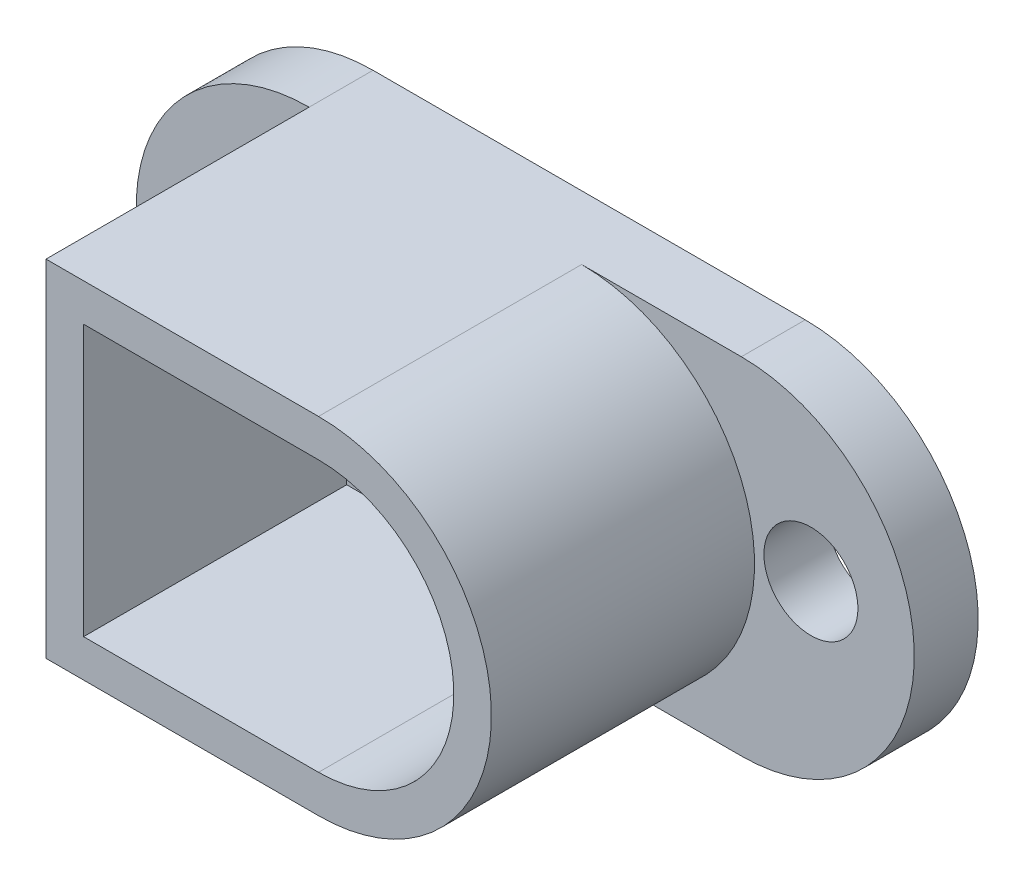
ISO-10303-21;
HEADER;
FILE_DESCRIPTION(('STEP AP214'),'2;1');
FILE_NAME('part.step','',(''),(''),'','','');
FILE_SCHEMA(('AUTOMOTIVE_DESIGN { 1 0 10303 214 1 1 1 1 }'));
ENDSEC;
DATA;
#1=APPLICATION_CONTEXT('core data for automotive mechanical design processes');
#2=APPLICATION_PROTOCOL_DEFINITION('international standard','automotive_design',2000,#1);
#3=PRODUCT_CONTEXT('',#1,'mechanical');
#4=PRODUCT('Part','Part','',(#3));
#5=PRODUCT_RELATED_PRODUCT_CATEGORY('part','',(#4));
#6=PRODUCT_DEFINITION_FORMATION('','',#4);
#7=PRODUCT_DEFINITION_CONTEXT('part definition',#1,'design');
#8=PRODUCT_DEFINITION('design','',#6,#7);
#9=PRODUCT_DEFINITION_SHAPE('','',#8);
#10=(LENGTH_UNIT() NAMED_UNIT(*) SI_UNIT(.MILLI.,.METRE.));
#11=(NAMED_UNIT(*) PLANE_ANGLE_UNIT() SI_UNIT($,.RADIAN.));
#12=(NAMED_UNIT(*) SI_UNIT($,.STERADIAN.) SOLID_ANGLE_UNIT());
#13=UNCERTAINTY_MEASURE_WITH_UNIT(LENGTH_MEASURE(1.E-05),#10,'distance_accuracy_value','');
#14=(GEOMETRIC_REPRESENTATION_CONTEXT(3) GLOBAL_UNCERTAINTY_ASSIGNED_CONTEXT((#13)) GLOBAL_UNIT_ASSIGNED_CONTEXT((#10,
#11,#12)) REPRESENTATION_CONTEXT('',''));
#15=CARTESIAN_POINT('',(0.,0.,0.));
#16=DIRECTION('',(0.,0.,1.));
#17=DIRECTION('',(1.,0.,0.));
#18=AXIS2_PLACEMENT_3D('',#15,#16,#17);
#19=CARTESIAN_POINT('',(0.,0.,7.));
#20=DIRECTION('',(0.,0.,-1.));
#21=DIRECTION('',(-1.,0.,0.));
#22=AXIS2_PLACEMENT_3D('',#19,#20,#21);
#23=PLANE('',#22);
#24=DIRECTION('',(1.,0.,0.));
#25=VECTOR('',#24,1.);
#26=CARTESIAN_POINT('',(-7.25,-4.6,7.));
#27=LINE('',#26,#25);
#28=CARTESIAN_POINT('',(-7.25,-4.6,7.));
#29=VERTEX_POINT('',#28);
#30=CARTESIAN_POINT('',(0.,-4.6,7.));
#31=VERTEX_POINT('',#30);
#32=EDGE_CURVE('E185',#29,#31,#27,.T.);
#33=ORIENTED_EDGE('',*,*,#32,.T.);
#34=CARTESIAN_POINT('',(0.,0.,7.));
#35=DIRECTION('',(0.,0.,1.));
#36=DIRECTION('',(-1.,0.,0.));
#37=AXIS2_PLACEMENT_3D('',#34,#35,#36);
#38=CIRCLE('',#37,4.6);
#39=CARTESIAN_POINT('',(0.,4.6,7.));
#40=VERTEX_POINT('',#39);
#41=EDGE_CURVE('E206',#31,#40,#38,.T.);
#42=ORIENTED_EDGE('',*,*,#41,.T.);
#43=DIRECTION('',(-1.,0.,0.));
#44=VECTOR('',#43,1.);
#45=CARTESIAN_POINT('',(-7.25,4.6,7.));
#46=LINE('',#45,#44);
#47=CARTESIAN_POINT('',(-7.25,4.6,7.));
#48=VERTEX_POINT('',#47);
#49=EDGE_CURVE('E202',#40,#48,#46,.T.);
#50=ORIENTED_EDGE('',*,*,#49,.T.);
#51=DIRECTION('',(0.,-1.,0.));
#52=VECTOR('',#51,1.);
#53=CARTESIAN_POINT('',(-7.25,-4.6,7.));
#54=LINE('',#53,#52);
#55=EDGE_CURVE('E197',#48,#29,#54,.T.);
#56=ORIENTED_EDGE('',*,*,#55,.T.);
#57=EDGE_LOOP('',(#33,#42,#50,#56));
#58=FACE_BOUND('',#57,.T.);
#59=DIRECTION('',(1.,0.,0.));
#60=VECTOR('',#59,1.);
#61=CARTESIAN_POINT('',(-6.25,-3.6,7.));
#62=LINE('',#61,#60);
#63=CARTESIAN_POINT('',(-6.25,-3.6,7.));
#64=VERTEX_POINT('',#63);
#65=CARTESIAN_POINT('',(0.,-3.6,7.));
#66=VERTEX_POINT('',#65);
#67=EDGE_CURVE('E219',#64,#66,#62,.T.);
#68=ORIENTED_EDGE('',*,*,#67,.F.);
#69=DIRECTION('',(0.,-1.,0.));
#70=VECTOR('',#69,1.);
#71=CARTESIAN_POINT('',(-6.25,-3.6,7.));
#72=LINE('',#71,#70);
#73=CARTESIAN_POINT('',(-6.25,3.6,7.));
#74=VERTEX_POINT('',#73);
#75=EDGE_CURVE('E215',#74,#64,#72,.T.);
#76=ORIENTED_EDGE('',*,*,#75,.F.);
#77=DIRECTION('',(-1.,0.,0.));
#78=VECTOR('',#77,1.);
#79=CARTESIAN_POINT('',(-6.25,3.6,7.));
#80=LINE('',#79,#78);
#81=CARTESIAN_POINT('',(0.,3.6,7.));
#82=VERTEX_POINT('',#81);
#83=EDGE_CURVE('E226',#82,#74,#80,.T.);
#84=ORIENTED_EDGE('',*,*,#83,.F.);
#85=CARTESIAN_POINT('',(0.,0.,7.));
#86=DIRECTION('',(0.,0.,1.));
#87=DIRECTION('',(-1.,0.,0.));
#88=AXIS2_PLACEMENT_3D('',#85,#86,#87);
#89=CIRCLE('',#88,3.6);
#90=EDGE_CURVE('E228',#66,#82,#89,.T.);
#91=ORIENTED_EDGE('',*,*,#90,.F.);
#92=EDGE_LOOP('',(#68,#76,#84,#91));
#93=FACE_BOUND('',#92,.T.);
#94=ADVANCED_FACE('F35',(#58,#93),#23,.F.);
#95=CARTESIAN_POINT('',(-7.25,-4.6,7.));
#96=DIRECTION('',(0.,1.,0.));
#97=DIRECTION('',(-1.,0.,0.));
#98=AXIS2_PLACEMENT_3D('',#95,#96,#97);
#99=PLANE('',#98);
#100=DIRECTION('',(0.,0.,-1.));
#101=VECTOR('',#100,1.);
#102=CARTESIAN_POINT('',(-7.25,-4.6,7.));
#103=LINE('',#102,#101);
#104=CARTESIAN_POINT('',(-7.25,-4.6,0.));
#105=VERTEX_POINT('',#104);
#106=EDGE_CURVE('E199',#29,#105,#103,.T.);
#107=ORIENTED_EDGE('',*,*,#106,.T.);
#108=DIRECTION('',(0.,0.,1.));
#109=VECTOR('',#108,1.);
#110=CARTESIAN_POINT('',(-7.25,-4.6,-1.7));
#111=LINE('',#110,#109);
#112=CARTESIAN_POINT('',(-7.25,-4.6,-1.7));
#113=VERTEX_POINT('',#112);
#114=EDGE_CURVE('E166',#113,#105,#111,.T.);
#115=ORIENTED_EDGE('',*,*,#114,.F.);
#116=DIRECTION('',(-1.,0.,0.));
#117=VECTOR('',#116,1.);
#118=CARTESIAN_POINT('',(4.25,-4.6,-1.7));
#119=LINE('',#118,#117);
#120=CARTESIAN_POINT('',(4.25,-4.6,-1.7));
#121=VERTEX_POINT('',#120);
#122=EDGE_CURVE('E140',#121,#113,#119,.T.);
#123=ORIENTED_EDGE('',*,*,#122,.F.);
#124=DIRECTION('',(0.,0.,1.));
#125=VECTOR('',#124,1.);
#126=CARTESIAN_POINT('',(4.25,-4.6,-1.7));
#127=LINE('',#126,#125);
#128=CARTESIAN_POINT('',(4.25,-4.6,0.));
#129=VERTEX_POINT('',#128);
#130=EDGE_CURVE('E152',#121,#129,#127,.T.);
#131=ORIENTED_EDGE('',*,*,#130,.T.);
#132=DIRECTION('',(-1.,0.,0.));
#133=VECTOR('',#132,1.);
#134=CARTESIAN_POINT('',(4.25,-4.6,0.));
#135=LINE('',#134,#133);
#136=CARTESIAN_POINT('',(0.,-4.6,0.));
#137=VERTEX_POINT('',#136);
#138=EDGE_CURVE('E143',#129,#137,#135,.T.);
#139=ORIENTED_EDGE('',*,*,#138,.T.);
#140=DIRECTION('',(0.,0.,-1.));
#141=VECTOR('',#140,1.);
#142=CARTESIAN_POINT('',(0.,-4.6,7.));
#143=LINE('',#142,#141);
#144=EDGE_CURVE('E11',#31,#137,#143,.T.);
#145=ORIENTED_EDGE('',*,*,#144,.F.);
#146=ORIENTED_EDGE('',*,*,#32,.F.);
#147=EDGE_LOOP('',(#107,#115,#123,#131,#139,#145,#146));
#148=FACE_BOUND('',#147,.T.);
#149=ADVANCED_FACE('F37',(#148),#99,.F.);
#150=CARTESIAN_POINT('',(0.,0.,7.));
#151=DIRECTION('',(0.,0.,-1.));
#152=DIRECTION('',(-1.,0.,0.));
#153=AXIS2_PLACEMENT_3D('',#150,#151,#152);
#154=CYLINDRICAL_SURFACE('',#153,4.6);
#155=CARTESIAN_POINT('',(0.,0.,0.));
#156=DIRECTION('',(0.,0.,1.));
#157=DIRECTION('',(-1.,0.,0.));
#158=AXIS2_PLACEMENT_3D('',#155,#156,#157);
#159=CIRCLE('',#158,4.6);
#160=CARTESIAN_POINT('',(0.,4.6,0.));
#161=VERTEX_POINT('',#160);
#162=EDGE_CURVE('E178',#137,#161,#159,.T.);
#163=ORIENTED_EDGE('',*,*,#162,.T.);
#164=DIRECTION('',(0.,0.,-1.));
#165=VECTOR('',#164,1.);
#166=CARTESIAN_POINT('',(0.,4.6,7.));
#167=LINE('',#166,#165);
#168=EDGE_CURVE('E44',#40,#161,#167,.T.);
#169=ORIENTED_EDGE('',*,*,#168,.F.);
#170=ORIENTED_EDGE('',*,*,#41,.F.);
#171=ORIENTED_EDGE('',*,*,#144,.T.);
#172=EDGE_LOOP('',(#163,#169,#170,#171));
#173=FACE_BOUND('',#172,.T.);
#174=ADVANCED_FACE('F260',(#173),#154,.T.);
#175=CARTESIAN_POINT('',(-7.25,4.6,7.));
#176=DIRECTION('',(0.,-1.,0.));
#177=DIRECTION('',(0.,0.,-1.));
#178=AXIS2_PLACEMENT_3D('',#175,#176,#177);
#179=PLANE('',#178);
#180=ORIENTED_EDGE('',*,*,#168,.T.);
#181=DIRECTION('',(1.,0.,0.));
#182=VECTOR('',#181,1.);
#183=CARTESIAN_POINT('',(-7.25,4.6,0.));
#184=LINE('',#183,#182);
#185=CARTESIAN_POINT('',(4.25,4.6,0.));
#186=VERTEX_POINT('',#185);
#187=EDGE_CURVE('E160',#161,#186,#184,.T.);
#188=ORIENTED_EDGE('',*,*,#187,.T.);
#189=DIRECTION('',(0.,0.,1.));
#190=VECTOR('',#189,1.);
#191=CARTESIAN_POINT('',(4.25,4.6,-1.7));
#192=LINE('',#191,#190);
#193=CARTESIAN_POINT('',(4.25,4.6,-1.7));
#194=VERTEX_POINT('',#193);
#195=EDGE_CURVE('E130',#194,#186,#192,.T.);
#196=ORIENTED_EDGE('',*,*,#195,.F.);
#197=DIRECTION('',(1.,0.,0.));
#198=VECTOR('',#197,1.);
#199=CARTESIAN_POINT('',(-7.25,4.6,-1.7));
#200=LINE('',#199,#198);
#201=CARTESIAN_POINT('',(-7.25,4.6,-1.7));
#202=VERTEX_POINT('',#201);
#203=EDGE_CURVE('E121',#202,#194,#200,.T.);
#204=ORIENTED_EDGE('',*,*,#203,.F.);
#205=DIRECTION('',(0.,0.,1.));
#206=VECTOR('',#205,1.);
#207=CARTESIAN_POINT('',(-7.25,4.6,-1.7));
#208=LINE('',#207,#206);
#209=CARTESIAN_POINT('',(-7.25,4.6,0.));
#210=VERTEX_POINT('',#209);
#211=EDGE_CURVE('E127',#202,#210,#208,.T.);
#212=ORIENTED_EDGE('',*,*,#211,.T.);
#213=DIRECTION('',(0.,0.,-1.));
#214=VECTOR('',#213,1.);
#215=CARTESIAN_POINT('',(-7.25,4.6,7.));
#216=LINE('',#215,#214);
#217=EDGE_CURVE('E192',#48,#210,#216,.T.);
#218=ORIENTED_EDGE('',*,*,#217,.F.);
#219=ORIENTED_EDGE('',*,*,#49,.F.);
#220=EDGE_LOOP('',(#180,#188,#196,#204,#212,#218,#219));
#221=FACE_BOUND('',#220,.T.);
#222=ADVANCED_FACE('F124',(#221),#179,.F.);
#223=CARTESIAN_POINT('',(-7.25,-4.6,7.));
#224=DIRECTION('',(1.,0.,0.));
#225=DIRECTION('',(0.,0.,-1.));
#226=AXIS2_PLACEMENT_3D('',#223,#224,#225);
#227=PLANE('',#226);
#228=DIRECTION('',(0.,-1.,0.));
#229=VECTOR('',#228,1.);
#230=CARTESIAN_POINT('',(-7.25,-4.6,0.));
#231=LINE('',#230,#229);
#232=EDGE_CURVE('E181',#210,#105,#231,.T.);
#233=ORIENTED_EDGE('',*,*,#232,.T.);
#234=ORIENTED_EDGE('',*,*,#106,.F.);
#235=ORIENTED_EDGE('',*,*,#55,.F.);
#236=ORIENTED_EDGE('',*,*,#217,.T.);
#237=EDGE_LOOP('',(#233,#234,#235,#236));
#238=FACE_BOUND('',#237,.T.);
#239=ADVANCED_FACE('F264',(#238),#227,.F.);
#240=CARTESIAN_POINT('',(-6.25,-3.6,7.));
#241=DIRECTION('',(0.,1.,0.));
#242=DIRECTION('',(-1.,0.,0.));
#243=AXIS2_PLACEMENT_3D('',#240,#241,#242);
#244=PLANE('',#243);
#245=DIRECTION('',(1.,0.,0.));
#246=VECTOR('',#245,1.);
#247=CARTESIAN_POINT('',(-6.25,-3.6,0.));
#248=LINE('',#247,#246);
#249=CARTESIAN_POINT('',(-6.25,-3.6,0.));
#250=VERTEX_POINT('',#249);
#251=CARTESIAN_POINT('',(0.,-3.6,0.));
#252=VERTEX_POINT('',#251);
#253=EDGE_CURVE('E59',#250,#252,#248,.T.);
#254=ORIENTED_EDGE('',*,*,#253,.F.);
#255=DIRECTION('',(0.,0.,-1.));
#256=VECTOR('',#255,1.);
#257=CARTESIAN_POINT('',(-6.25,-3.6,7.));
#258=LINE('',#257,#256);
#259=EDGE_CURVE('E213',#64,#250,#258,.T.);
#260=ORIENTED_EDGE('',*,*,#259,.F.);
#261=ORIENTED_EDGE('',*,*,#67,.T.);
#262=DIRECTION('',(0.,0.,-1.));
#263=VECTOR('',#262,1.);
#264=CARTESIAN_POINT('',(0.,-3.6,7.));
#265=LINE('',#264,#263);
#266=EDGE_CURVE('E182',#66,#252,#265,.T.);
#267=ORIENTED_EDGE('',*,*,#266,.T.);
#268=EDGE_LOOP('',(#254,#260,#261,#267));
#269=FACE_BOUND('',#268,.T.);
#270=ADVANCED_FACE('F231',(#269),#244,.T.);
#271=CARTESIAN_POINT('',(0.,0.,7.));
#272=DIRECTION('',(0.,0.,-1.));
#273=DIRECTION('',(-1.,0.,0.));
#274=AXIS2_PLACEMENT_3D('',#271,#272,#273);
#275=CYLINDRICAL_SURFACE('',#274,3.6);
#276=CARTESIAN_POINT('',(0.,0.,0.));
#277=DIRECTION('',(0.,0.,1.));
#278=DIRECTION('',(-1.,0.,0.));
#279=AXIS2_PLACEMENT_3D('',#276,#277,#278);
#280=CIRCLE('',#279,3.6);
#281=CARTESIAN_POINT('',(0.,3.6,0.));
#282=VERTEX_POINT('',#281);
#283=EDGE_CURVE('E150',#252,#282,#280,.T.);
#284=ORIENTED_EDGE('',*,*,#283,.F.);
#285=ORIENTED_EDGE('',*,*,#266,.F.);
#286=ORIENTED_EDGE('',*,*,#90,.T.);
#287=DIRECTION('',(0.,0.,-1.));
#288=VECTOR('',#287,1.);
#289=CARTESIAN_POINT('',(0.,3.6,7.));
#290=LINE('',#289,#288);
#291=EDGE_CURVE('E187',#82,#282,#290,.T.);
#292=ORIENTED_EDGE('',*,*,#291,.T.);
#293=EDGE_LOOP('',(#284,#285,#286,#292));
#294=FACE_BOUND('',#293,.T.);
#295=ADVANCED_FACE('F236',(#294),#275,.F.);
#296=CARTESIAN_POINT('',(-6.25,3.6,7.));
#297=DIRECTION('',(0.,-1.,0.));
#298=DIRECTION('',(0.,0.,-1.));
#299=AXIS2_PLACEMENT_3D('',#296,#297,#298);
#300=PLANE('',#299);
#301=DIRECTION('',(-1.,0.,0.));
#302=VECTOR('',#301,1.);
#303=CARTESIAN_POINT('',(-6.25,3.6,0.));
#304=LINE('',#303,#302);
#305=CARTESIAN_POINT('',(-6.25,3.6,0.));
#306=VERTEX_POINT('',#305);
#307=EDGE_CURVE('E220',#282,#306,#304,.T.);
#308=ORIENTED_EDGE('',*,*,#307,.F.);
#309=ORIENTED_EDGE('',*,*,#291,.F.);
#310=ORIENTED_EDGE('',*,*,#83,.T.);
#311=DIRECTION('',(0.,0.,-1.));
#312=VECTOR('',#311,1.);
#313=CARTESIAN_POINT('',(-6.25,3.6,7.));
#314=LINE('',#313,#312);
#315=EDGE_CURVE('E51',#74,#306,#314,.T.);
#316=ORIENTED_EDGE('',*,*,#315,.T.);
#317=EDGE_LOOP('',(#308,#309,#310,#316));
#318=FACE_BOUND('',#317,.T.);
#319=ADVANCED_FACE('F241',(#318),#300,.T.);
#320=CARTESIAN_POINT('',(-6.25,-3.6,7.));
#321=DIRECTION('',(1.,0.,0.));
#322=DIRECTION('',(0.,0.,-1.));
#323=AXIS2_PLACEMENT_3D('',#320,#321,#322);
#324=PLANE('',#323);
#325=DIRECTION('',(0.,-1.,0.));
#326=VECTOR('',#325,1.);
#327=CARTESIAN_POINT('',(-6.25,-3.6,0.));
#328=LINE('',#327,#326);
#329=EDGE_CURVE('E216',#306,#250,#328,.T.);
#330=ORIENTED_EDGE('',*,*,#329,.F.);
#331=ORIENTED_EDGE('',*,*,#315,.F.);
#332=ORIENTED_EDGE('',*,*,#75,.T.);
#333=ORIENTED_EDGE('',*,*,#259,.T.);
#334=EDGE_LOOP('',(#330,#331,#332,#333));
#335=FACE_BOUND('',#334,.T.);
#336=ADVANCED_FACE('F244',(#335),#324,.T.);
#337=CARTESIAN_POINT('',(-7.25,0.,0.));
#338=DIRECTION('',(0.,0.,1.));
#339=DIRECTION('',(1.,0.,0.));
#340=AXIS2_PLACEMENT_3D('',#337,#338,#339);
#341=PLANE('',#340);
#342=ORIENTED_EDGE('',*,*,#307,.T.);
#343=ORIENTED_EDGE('',*,*,#329,.T.);
#344=ORIENTED_EDGE('',*,*,#253,.T.);
#345=ORIENTED_EDGE('',*,*,#283,.T.);
#346=EDGE_LOOP('',(#342,#343,#344,#345));
#347=FACE_BOUND('',#346,.T.);
#348=ADVANCED_FACE('F243',(#347),#341,.T.);
#349=CARTESIAN_POINT('',(-9.1,0.35,0.));
#350=DIRECTION('',(0.,0.,-1.));
#351=DIRECTION('',(-1.,0.,0.));
#352=AXIS2_PLACEMENT_3D('',#349,#350,#351);
#353=CIRCLE('',#352,1.25);
#354=CARTESIAN_POINT('',(-10.35,0.35,0.));
#355=VERTEX_POINT('',#354);
#356=EDGE_CURVE('E380',#355,#355,#353,.T.);
#357=ORIENTED_EDGE('',*,*,#356,.T.);
#358=EDGE_LOOP('',(#357));
#359=FACE_BOUND('',#358,.T.);
#360=ORIENTED_EDGE('',*,*,#232,.F.);
#361=CARTESIAN_POINT('',(-7.25,0.,0.));
#362=DIRECTION('',(0.,0.,-1.));
#363=DIRECTION('',(1.,0.,0.));
#364=AXIS2_PLACEMENT_3D('',#361,#362,#363);
#365=CIRCLE('',#364,4.6);
#366=EDGE_CURVE('E147',#105,#210,#365,.T.);
#367=ORIENTED_EDGE('',*,*,#366,.F.);
#368=EDGE_LOOP('',(#360,#367));
#369=FACE_BOUND('',#368,.T.);
#370=ADVANCED_FACE('F251',(#359,#369),#341,.T.);
#371=CARTESIAN_POINT('',(6.1,0.349999999999999,0.));
#372=DIRECTION('',(0.,0.,-1.));
#373=DIRECTION('',(-1.,0.,0.));
#374=AXIS2_PLACEMENT_3D('',#371,#372,#373);
#375=CIRCLE('',#374,1.25);
#376=CARTESIAN_POINT('',(4.85,0.349999999999999,0.));
#377=VERTEX_POINT('',#376);
#378=EDGE_CURVE('E378',#377,#377,#375,.T.);
#379=ORIENTED_EDGE('',*,*,#378,.T.);
#380=EDGE_LOOP('',(#379));
#381=FACE_BOUND('',#380,.T.);
#382=ORIENTED_EDGE('',*,*,#162,.F.);
#383=ORIENTED_EDGE('',*,*,#138,.F.);
#384=CARTESIAN_POINT('',(4.25,0.,0.));
#385=DIRECTION('',(0.,0.,-1.));
#386=DIRECTION('',(-1.,0.,0.));
#387=AXIS2_PLACEMENT_3D('',#384,#385,#386);
#388=CIRCLE('',#387,4.6);
#389=EDGE_CURVE('E159',#186,#129,#388,.T.);
#390=ORIENTED_EDGE('',*,*,#389,.F.);
#391=ORIENTED_EDGE('',*,*,#187,.F.);
#392=EDGE_LOOP('',(#382,#383,#390,#391));
#393=FACE_BOUND('',#392,.T.);
#394=ADVANCED_FACE('F176',(#381,#393),#341,.T.);
#395=CARTESIAN_POINT('',(-7.25,0.,-1.7));
#396=DIRECTION('',(0.,0.,1.));
#397=DIRECTION('',(1.,0.,0.));
#398=AXIS2_PLACEMENT_3D('',#395,#396,#397);
#399=PLANE('',#398);
#400=CARTESIAN_POINT('',(-9.1,0.35,-1.7));
#401=DIRECTION('',(0.,0.,-1.));
#402=DIRECTION('',(-1.,0.,0.));
#403=AXIS2_PLACEMENT_3D('',#400,#401,#402);
#404=CIRCLE('',#403,1.25);
#405=CARTESIAN_POINT('',(-10.35,0.35,-1.7));
#406=VERTEX_POINT('',#405);
#407=EDGE_CURVE('E383',#406,#406,#404,.T.);
#408=ORIENTED_EDGE('',*,*,#407,.F.);
#409=EDGE_LOOP('',(#408));
#410=FACE_BOUND('',#409,.T.);
#411=CARTESIAN_POINT('',(-7.25,0.,-1.7));
#412=DIRECTION('',(0.,0.,-1.));
#413=DIRECTION('',(1.,0.,0.));
#414=AXIS2_PLACEMENT_3D('',#411,#412,#413);
#415=CIRCLE('',#414,4.6);
#416=EDGE_CURVE('E134',#113,#202,#415,.T.);
#417=ORIENTED_EDGE('',*,*,#416,.T.);
#418=ORIENTED_EDGE('',*,*,#203,.T.);
#419=CARTESIAN_POINT('',(4.25,0.,-1.7));
#420=DIRECTION('',(0.,0.,-1.));
#421=DIRECTION('',(-1.,0.,0.));
#422=AXIS2_PLACEMENT_3D('',#419,#420,#421);
#423=CIRCLE('',#422,4.6);
#424=EDGE_CURVE('E133',#194,#121,#423,.T.);
#425=ORIENTED_EDGE('',*,*,#424,.T.);
#426=ORIENTED_EDGE('',*,*,#122,.T.);
#427=EDGE_LOOP('',(#417,#418,#425,#426));
#428=FACE_BOUND('',#427,.T.);
#429=CARTESIAN_POINT('',(6.1,0.349999999999999,-1.7));
#430=DIRECTION('',(0.,0.,-1.));
#431=DIRECTION('',(-1.,0.,0.));
#432=AXIS2_PLACEMENT_3D('',#429,#430,#431);
#433=CIRCLE('',#432,1.25);
#434=CARTESIAN_POINT('',(4.85,0.349999999999999,-1.7));
#435=VERTEX_POINT('',#434);
#436=EDGE_CURVE('E375',#435,#435,#433,.T.);
#437=ORIENTED_EDGE('',*,*,#436,.F.);
#438=EDGE_LOOP('',(#437));
#439=FACE_BOUND('',#438,.T.);
#440=ADVANCED_FACE('F137',(#410,#428,#439),#399,.F.);
#441=CARTESIAN_POINT('',(-7.25,0.,-1.7));
#442=DIRECTION('',(0.,0.,1.));
#443=DIRECTION('',(1.,0.,0.));
#444=AXIS2_PLACEMENT_3D('',#441,#442,#443);
#445=CYLINDRICAL_SURFACE('',#444,4.6);
#446=ORIENTED_EDGE('',*,*,#366,.T.);
#447=ORIENTED_EDGE('',*,*,#211,.F.);
#448=ORIENTED_EDGE('',*,*,#416,.F.);
#449=ORIENTED_EDGE('',*,*,#114,.T.);
#450=EDGE_LOOP('',(#446,#447,#448,#449));
#451=FACE_BOUND('',#450,.T.);
#452=ADVANCED_FACE('F145',(#451),#445,.T.);
#453=CARTESIAN_POINT('',(4.25,0.,-1.7));
#454=DIRECTION('',(0.,0.,1.));
#455=DIRECTION('',(1.,0.,0.));
#456=AXIS2_PLACEMENT_3D('',#453,#454,#455);
#457=CYLINDRICAL_SURFACE('',#456,4.6);
#458=ORIENTED_EDGE('',*,*,#389,.T.);
#459=ORIENTED_EDGE('',*,*,#130,.F.);
#460=ORIENTED_EDGE('',*,*,#424,.F.);
#461=ORIENTED_EDGE('',*,*,#195,.T.);
#462=EDGE_LOOP('',(#458,#459,#460,#461));
#463=FACE_BOUND('',#462,.T.);
#464=ADVANCED_FACE('F341',(#463),#457,.T.);
#465=CARTESIAN_POINT('',(-9.1,0.35,-1.7));
#466=DIRECTION('',(0.,0.,1.));
#467=DIRECTION('',(1.,0.,0.));
#468=AXIS2_PLACEMENT_3D('',#465,#466,#467);
#469=CYLINDRICAL_SURFACE('',#468,1.25);
#470=ORIENTED_EDGE('',*,*,#407,.T.);
#471=EDGE_LOOP('',(#470));
#472=FACE_BOUND('',#471,.T.);
#473=ORIENTED_EDGE('',*,*,#356,.F.);
#474=EDGE_LOOP('',(#473));
#475=FACE_BOUND('',#474,.T.);
#476=ADVANCED_FACE('F349',(#472,#475),#469,.F.);
#477=CARTESIAN_POINT('',(6.1,0.349999999999999,-1.7));
#478=DIRECTION('',(0.,0.,1.));
#479=DIRECTION('',(1.,0.,0.));
#480=AXIS2_PLACEMENT_3D('',#477,#478,#479);
#481=CYLINDRICAL_SURFACE('',#480,1.25);
#482=ORIENTED_EDGE('',*,*,#436,.T.);
#483=EDGE_LOOP('',(#482));
#484=FACE_BOUND('',#483,.T.);
#485=ORIENTED_EDGE('',*,*,#378,.F.);
#486=EDGE_LOOP('',(#485));
#487=FACE_BOUND('',#486,.T.);
#488=ADVANCED_FACE('F358',(#484,#487),#481,.F.);
#489=CLOSED_SHELL('',(#94,#149,#174,#222,#239,#270,#295,#319,#336,#348,#370,#394,#440,#452,#464,
#476,#488));
#490=MANIFOLD_SOLID_BREP('B2',#489);
#491=ADVANCED_BREP_SHAPE_REPRESENTATION('',(#18,#490),#14);
#492=SHAPE_DEFINITION_REPRESENTATION(#9,#491);
ENDSEC;
END-ISO-10303-21;
